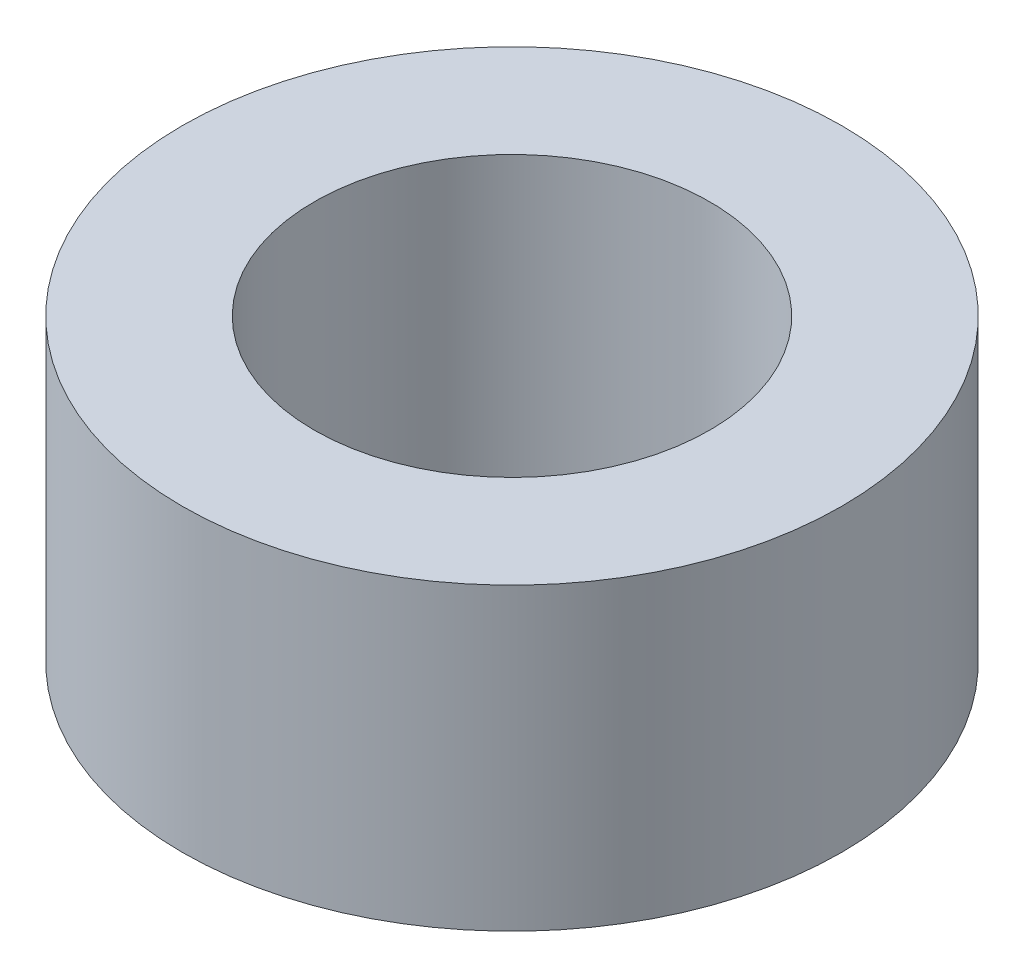
ISO-10303-21;
HEADER;
FILE_DESCRIPTION(('STEP AP214'),'2;1');
FILE_NAME('part.step','',(''),(''),'','','');
FILE_SCHEMA(('AUTOMOTIVE_DESIGN { 1 0 10303 214 1 1 1 1 }'));
ENDSEC;
DATA;
#1=APPLICATION_CONTEXT('core data for automotive mechanical design processes');
#2=APPLICATION_PROTOCOL_DEFINITION('international standard','automotive_design',2000,#1);
#3=PRODUCT_CONTEXT('',#1,'mechanical');
#4=PRODUCT('Part','Part','',(#3));
#5=PRODUCT_RELATED_PRODUCT_CATEGORY('part','',(#4));
#6=PRODUCT_DEFINITION_FORMATION('','',#4);
#7=PRODUCT_DEFINITION_CONTEXT('part definition',#1,'design');
#8=PRODUCT_DEFINITION('design','',#6,#7);
#9=PRODUCT_DEFINITION_SHAPE('','',#8);
#10=(LENGTH_UNIT() NAMED_UNIT(*) SI_UNIT(.MILLI.,.METRE.));
#11=(NAMED_UNIT(*) PLANE_ANGLE_UNIT() SI_UNIT($,.RADIAN.));
#12=(NAMED_UNIT(*) SI_UNIT($,.STERADIAN.) SOLID_ANGLE_UNIT());
#13=UNCERTAINTY_MEASURE_WITH_UNIT(LENGTH_MEASURE(1.E-05),#10,'distance_accuracy_value','');
#14=(GEOMETRIC_REPRESENTATION_CONTEXT(3) GLOBAL_UNCERTAINTY_ASSIGNED_CONTEXT((#13)) GLOBAL_UNIT_ASSIGNED_CONTEXT((#10,
#11,#12)) REPRESENTATION_CONTEXT('',''));
#15=CARTESIAN_POINT('',(0.,0.,0.));
#16=DIRECTION('',(0.,0.,1.));
#17=DIRECTION('',(1.,0.,0.));
#18=AXIS2_PLACEMENT_3D('',#15,#16,#17);
#19=CARTESIAN_POINT('',(0.,5.,0.));
#20=DIRECTION('',(0.,1.,0.));
#21=DIRECTION('',(0.,0.,1.));
#22=AXIS2_PLACEMENT_3D('',#19,#20,#21);
#23=PLANE('',#22);
#24=CARTESIAN_POINT('',(0.,5.,0.));
#25=DIRECTION('',(0.,1.,0.));
#26=DIRECTION('',(0.,0.,1.));
#27=AXIS2_PLACEMENT_3D('',#24,#25,#26);
#28=CIRCLE('',#27,3.3);
#29=CARTESIAN_POINT('',(0.,5.,3.3));
#30=VERTEX_POINT('',#29);
#31=EDGE_CURVE('E43',#30,#30,#28,.T.);
#32=ORIENTED_EDGE('',*,*,#31,.F.);
#33=EDGE_LOOP('',(#32));
#34=FACE_BOUND('',#33,.T.);
#35=CARTESIAN_POINT('',(0.,5.,0.));
#36=DIRECTION('',(0.,1.,0.));
#37=DIRECTION('',(0.,0.,1.));
#38=AXIS2_PLACEMENT_3D('',#35,#36,#37);
#39=CIRCLE('',#38,5.5);
#40=CARTESIAN_POINT('',(0.,5.,5.5));
#41=VERTEX_POINT('',#40);
#42=EDGE_CURVE('E47',#41,#41,#39,.T.);
#43=ORIENTED_EDGE('',*,*,#42,.T.);
#44=EDGE_LOOP('',(#43));
#45=FACE_BOUND('',#44,.T.);
#46=ADVANCED_FACE('F32',(#34,#45),#23,.T.);
#47=CARTESIAN_POINT('',(0.,0.,0.));
#48=DIRECTION('',(0.,1.,0.));
#49=DIRECTION('',(0.,0.,1.));
#50=AXIS2_PLACEMENT_3D('',#47,#48,#49);
#51=PLANE('',#50);
#52=CARTESIAN_POINT('',(0.,0.,0.));
#53=DIRECTION('',(0.,1.,0.));
#54=DIRECTION('',(0.,0.,1.));
#55=AXIS2_PLACEMENT_3D('',#52,#53,#54);
#56=CIRCLE('',#55,3.3);
#57=CARTESIAN_POINT('',(0.,0.,3.3));
#58=VERTEX_POINT('',#57);
#59=EDGE_CURVE('E39',#58,#58,#56,.T.);
#60=ORIENTED_EDGE('',*,*,#59,.T.);
#61=EDGE_LOOP('',(#60));
#62=FACE_BOUND('',#61,.T.);
#63=CARTESIAN_POINT('',(0.,0.,0.));
#64=DIRECTION('',(0.,1.,0.));
#65=DIRECTION('',(0.,0.,1.));
#66=AXIS2_PLACEMENT_3D('',#63,#64,#65);
#67=CIRCLE('',#66,5.5);
#68=CARTESIAN_POINT('',(0.,0.,5.5));
#69=VERTEX_POINT('',#68);
#70=EDGE_CURVE('E11',#69,#69,#67,.T.);
#71=ORIENTED_EDGE('',*,*,#70,.F.);
#72=EDGE_LOOP('',(#71));
#73=FACE_BOUND('',#72,.T.);
#74=ADVANCED_FACE('F34',(#62,#73),#51,.F.);
#75=CARTESIAN_POINT('',(0.,5.,0.));
#76=DIRECTION('',(0.,1.,0.));
#77=DIRECTION('',(0.,0.,1.));
#78=AXIS2_PLACEMENT_3D('',#75,#76,#77);
#79=CYLINDRICAL_SURFACE('',#78,3.3);
#80=ORIENTED_EDGE('',*,*,#59,.F.);
#81=EDGE_LOOP('',(#80));
#82=FACE_BOUND('',#81,.T.);
#83=ORIENTED_EDGE('',*,*,#31,.T.);
#84=EDGE_LOOP('',(#83));
#85=FACE_BOUND('',#84,.T.);
#86=ADVANCED_FACE('F56',(#82,#85),#79,.F.);
#87=CARTESIAN_POINT('',(0.,0.,0.));
#88=DIRECTION('',(0.,1.,0.));
#89=DIRECTION('',(0.,0.,1.));
#90=AXIS2_PLACEMENT_3D('',#87,#88,#89);
#91=CYLINDRICAL_SURFACE('',#90,5.5);
#92=ORIENTED_EDGE('',*,*,#42,.F.);
#93=EDGE_LOOP('',(#92));
#94=FACE_BOUND('',#93,.T.);
#95=ORIENTED_EDGE('',*,*,#70,.T.);
#96=EDGE_LOOP('',(#95));
#97=FACE_BOUND('',#96,.T.);
#98=ADVANCED_FACE('F54',(#94,#97),#91,.T.);
#99=CLOSED_SHELL('',(#46,#74,#86,#98));
#100=MANIFOLD_SOLID_BREP('B2',#99);
#101=ADVANCED_BREP_SHAPE_REPRESENTATION('',(#18,#100),#14);
#102=SHAPE_DEFINITION_REPRESENTATION(#9,#101);
ENDSEC;
END-ISO-10303-21;
